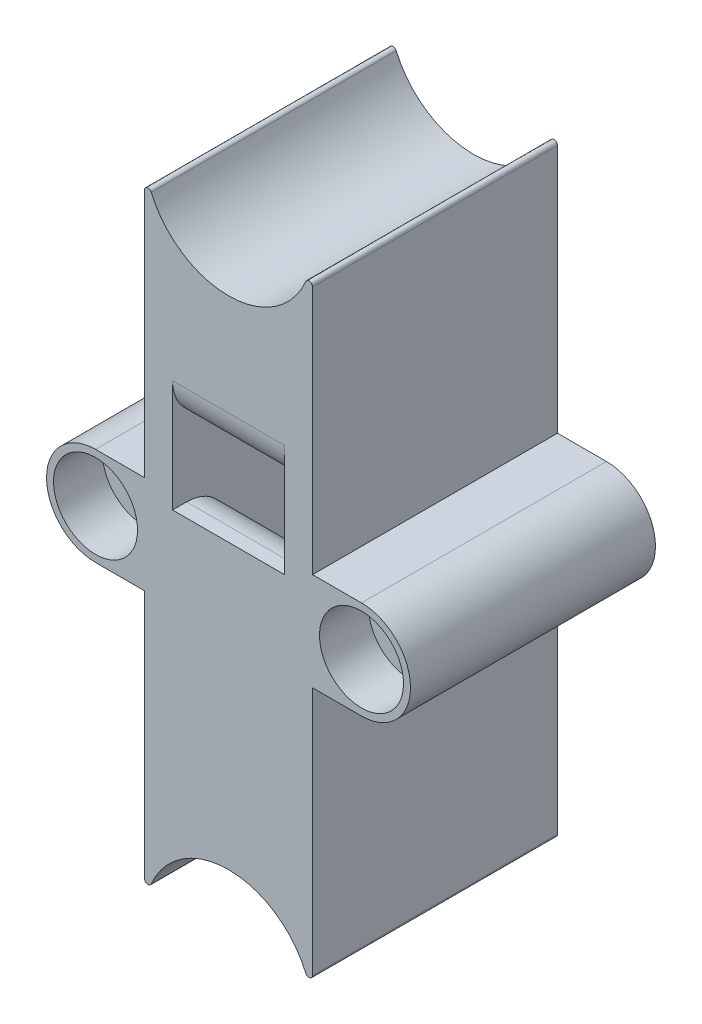
ISO-10303-21;
HEADER;
FILE_DESCRIPTION(('STEP AP214'),'2;1');
FILE_NAME('part.step','',(''),(''),'','','');
FILE_SCHEMA(('AUTOMOTIVE_DESIGN { 1 0 10303 214 1 1 1 1 }'));
ENDSEC;
DATA;
#1=APPLICATION_CONTEXT('core data for automotive mechanical design processes');
#2=APPLICATION_PROTOCOL_DEFINITION('international standard','automotive_design',2000,#1);
#3=PRODUCT_CONTEXT('',#1,'mechanical');
#4=PRODUCT('Part','Part','',(#3));
#5=PRODUCT_RELATED_PRODUCT_CATEGORY('part','',(#4));
#6=PRODUCT_DEFINITION_FORMATION('','',#4);
#7=PRODUCT_DEFINITION_CONTEXT('part definition',#1,'design');
#8=PRODUCT_DEFINITION('design','',#6,#7);
#9=PRODUCT_DEFINITION_SHAPE('','',#8);
#10=(LENGTH_UNIT() NAMED_UNIT(*) SI_UNIT(.MILLI.,.METRE.));
#11=(NAMED_UNIT(*) PLANE_ANGLE_UNIT() SI_UNIT($,.RADIAN.));
#12=(NAMED_UNIT(*) SI_UNIT($,.STERADIAN.) SOLID_ANGLE_UNIT());
#13=UNCERTAINTY_MEASURE_WITH_UNIT(LENGTH_MEASURE(1.E-05),#10,'distance_accuracy_value','');
#14=(GEOMETRIC_REPRESENTATION_CONTEXT(3) GLOBAL_UNCERTAINTY_ASSIGNED_CONTEXT((#13)) GLOBAL_UNIT_ASSIGNED_CONTEXT((#10,
#11,#12)) REPRESENTATION_CONTEXT('',''));
#15=CARTESIAN_POINT('',(0.,0.,0.));
#16=DIRECTION('',(0.,0.,1.));
#17=DIRECTION('',(1.,0.,0.));
#18=AXIS2_PLACEMENT_3D('',#15,#16,#17);
#19=CARTESIAN_POINT('',(-9.5,0.,17.5));
#20=DIRECTION('',(0.,0.,-1.));
#21=DIRECTION('',(-1.,0.,0.));
#22=AXIS2_PLACEMENT_3D('',#19,#20,#21);
#23=CYLINDRICAL_SURFACE('',#22,1.65);
#24=CARTESIAN_POINT('',(-9.5,0.,0.));
#25=DIRECTION('',(0.,0.,1.));
#26=DIRECTION('',(1.,0.,0.));
#27=AXIS2_PLACEMENT_3D('',#24,#25,#26);
#28=CIRCLE('',#27,1.65);
#29=CARTESIAN_POINT('',(-7.85,0.,0.));
#30=VERTEX_POINT('',#29);
#31=EDGE_CURVE('E317',#30,#30,#28,.T.);
#32=ORIENTED_EDGE('',*,*,#31,.F.);
#33=EDGE_LOOP('',(#32));
#34=FACE_BOUND('',#33,.T.);
#35=CARTESIAN_POINT('',(-9.5,0.,14.));
#36=DIRECTION('',(0.,0.,1.));
#37=DIRECTION('',(1.,0.,0.));
#38=AXIS2_PLACEMENT_3D('',#35,#36,#37);
#39=CIRCLE('',#38,1.65);
#40=CARTESIAN_POINT('',(-7.85,0.,14.));
#41=VERTEX_POINT('',#40);
#42=EDGE_CURVE('E45',#41,#41,#39,.T.);
#43=ORIENTED_EDGE('',*,*,#42,.T.);
#44=EDGE_LOOP('',(#43));
#45=FACE_BOUND('',#44,.T.);
#46=ADVANCED_FACE('F41',(#34,#45),#23,.F.);
#47=CARTESIAN_POINT('',(9.5,0.,17.5));
#48=DIRECTION('',(0.,0.,-1.));
#49=DIRECTION('',(-1.,0.,0.));
#50=AXIS2_PLACEMENT_3D('',#47,#48,#49);
#51=CYLINDRICAL_SURFACE('',#50,1.65);
#52=CARTESIAN_POINT('',(9.5,0.,0.));
#53=DIRECTION('',(0.,0.,1.));
#54=DIRECTION('',(1.,0.,0.));
#55=AXIS2_PLACEMENT_3D('',#52,#53,#54);
#56=CIRCLE('',#55,1.65);
#57=CARTESIAN_POINT('',(11.15,0.,0.));
#58=VERTEX_POINT('',#57);
#59=EDGE_CURVE('E265',#58,#58,#56,.T.);
#60=ORIENTED_EDGE('',*,*,#59,.F.);
#61=EDGE_LOOP('',(#60));
#62=FACE_BOUND('',#61,.T.);
#63=CARTESIAN_POINT('',(9.5,0.,14.));
#64=DIRECTION('',(0.,0.,1.));
#65=DIRECTION('',(1.,0.,0.));
#66=AXIS2_PLACEMENT_3D('',#63,#64,#65);
#67=CIRCLE('',#66,1.65);
#68=CARTESIAN_POINT('',(11.15,0.,14.));
#69=VERTEX_POINT('',#68);
#70=EDGE_CURVE('E228',#69,#69,#67,.T.);
#71=ORIENTED_EDGE('',*,*,#70,.T.);
#72=EDGE_LOOP('',(#71));
#73=FACE_BOUND('',#72,.T.);
#74=ADVANCED_FACE('F426',(#62,#73),#51,.F.);
#75=CARTESIAN_POINT('',(0.,3.5,17.5));
#76=DIRECTION('',(0.,-1.,0.));
#77=DIRECTION('',(1.,0.,0.));
#78=AXIS2_PLACEMENT_3D('',#75,#76,#77);
#79=PLANE('',#78);
#80=DIRECTION('',(-1.,0.,0.));
#81=VECTOR('',#80,1.);
#82=CARTESIAN_POINT('',(0.,3.5,0.));
#83=LINE('',#82,#81);
#84=CARTESIAN_POINT('',(-6.,3.5,0.));
#85=VERTEX_POINT('',#84);
#86=CARTESIAN_POINT('',(-9.5,3.5,0.));
#87=VERTEX_POINT('',#86);
#88=EDGE_CURVE('E253',#85,#87,#83,.T.);
#89=ORIENTED_EDGE('',*,*,#88,.T.);
#90=DIRECTION('',(0.,0.,-1.));
#91=VECTOR('',#90,1.);
#92=CARTESIAN_POINT('',(-9.5,3.5,17.5));
#93=LINE('',#92,#91);
#94=CARTESIAN_POINT('',(-9.5,3.5,17.5));
#95=VERTEX_POINT('',#94);
#96=EDGE_CURVE('E339',#95,#87,#93,.T.);
#97=ORIENTED_EDGE('',*,*,#96,.F.);
#98=DIRECTION('',(-1.,0.,0.));
#99=VECTOR('',#98,1.);
#100=CARTESIAN_POINT('',(0.,3.5,17.5));
#101=LINE('',#100,#99);
#102=CARTESIAN_POINT('',(-6.,3.5,17.5));
#103=VERTEX_POINT('',#102);
#104=EDGE_CURVE('E261',#103,#95,#101,.T.);
#105=ORIENTED_EDGE('',*,*,#104,.F.);
#106=DIRECTION('',(0.,0.,-1.));
#107=VECTOR('',#106,1.);
#108=CARTESIAN_POINT('',(-6.,3.5,17.5));
#109=LINE('',#108,#107);
#110=EDGE_CURVE('E322',#103,#85,#109,.T.);
#111=ORIENTED_EDGE('',*,*,#110,.T.);
#112=EDGE_LOOP('',(#89,#97,#105,#111));
#113=FACE_BOUND('',#112,.T.);
#114=ADVANCED_FACE('F432',(#113),#79,.F.);
#115=CARTESIAN_POINT('',(-9.5,0.,17.5));
#116=DIRECTION('',(0.,0.,-1.));
#117=DIRECTION('',(-1.,0.,0.));
#118=AXIS2_PLACEMENT_3D('',#115,#116,#117);
#119=CYLINDRICAL_SURFACE('',#118,3.5);
#120=CARTESIAN_POINT('',(-9.5,0.,0.));
#121=DIRECTION('',(0.,0.,1.));
#122=DIRECTION('',(1.,0.,0.));
#123=AXIS2_PLACEMENT_3D('',#120,#121,#122);
#124=CIRCLE('',#123,3.5);
#125=CARTESIAN_POINT('',(-9.5,-3.5,0.));
#126=VERTEX_POINT('',#125);
#127=EDGE_CURVE('E291',#87,#126,#124,.T.);
#128=ORIENTED_EDGE('',*,*,#127,.T.);
#129=DIRECTION('',(0.,0.,-1.));
#130=VECTOR('',#129,1.);
#131=CARTESIAN_POINT('',(-9.5,-3.5,17.5));
#132=LINE('',#131,#130);
#133=CARTESIAN_POINT('',(-9.5,-3.5,17.5));
#134=VERTEX_POINT('',#133);
#135=EDGE_CURVE('E337',#134,#126,#132,.T.);
#136=ORIENTED_EDGE('',*,*,#135,.F.);
#137=CARTESIAN_POINT('',(-9.5,0.,17.5));
#138=DIRECTION('',(0.,0.,1.));
#139=DIRECTION('',(1.,0.,0.));
#140=AXIS2_PLACEMENT_3D('',#137,#138,#139);
#141=CIRCLE('',#140,3.5);
#142=EDGE_CURVE('E264',#95,#134,#141,.T.);
#143=ORIENTED_EDGE('',*,*,#142,.F.);
#144=ORIENTED_EDGE('',*,*,#96,.T.);
#145=EDGE_LOOP('',(#128,#136,#143,#144));
#146=FACE_BOUND('',#145,.T.);
#147=ADVANCED_FACE('F473',(#146),#119,.T.);
#148=CARTESIAN_POINT('',(0.,-3.5,17.5));
#149=DIRECTION('',(0.,-1.,0.));
#150=DIRECTION('',(1.,0.,0.));
#151=AXIS2_PLACEMENT_3D('',#148,#149,#150);
#152=PLANE('',#151);
#153=DIRECTION('',(-1.,0.,0.));
#154=VECTOR('',#153,1.);
#155=CARTESIAN_POINT('',(0.,-3.5,0.));
#156=LINE('',#155,#154);
#157=CARTESIAN_POINT('',(-6.,-3.5,0.));
#158=VERTEX_POINT('',#157);
#159=EDGE_CURVE('E294',#158,#126,#156,.T.);
#160=ORIENTED_EDGE('',*,*,#159,.F.);
#161=DIRECTION('',(0.,0.,-1.));
#162=VECTOR('',#161,1.);
#163=CARTESIAN_POINT('',(-6.,-3.5,17.5));
#164=LINE('',#163,#162);
#165=CARTESIAN_POINT('',(-6.,-3.5,17.5));
#166=VERTEX_POINT('',#165);
#167=EDGE_CURVE('E334',#166,#158,#164,.T.);
#168=ORIENTED_EDGE('',*,*,#167,.F.);
#169=DIRECTION('',(-1.,0.,0.));
#170=VECTOR('',#169,1.);
#171=CARTESIAN_POINT('',(0.,-3.5,17.5));
#172=LINE('',#171,#170);
#173=EDGE_CURVE('E267',#166,#134,#172,.T.);
#174=ORIENTED_EDGE('',*,*,#173,.T.);
#175=ORIENTED_EDGE('',*,*,#135,.T.);
#176=EDGE_LOOP('',(#160,#168,#174,#175));
#177=FACE_BOUND('',#176,.T.);
#178=ADVANCED_FACE('F470',(#177),#152,.T.);
#179=CARTESIAN_POINT('',(-6.,0.,17.5));
#180=DIRECTION('',(-1.,0.,0.));
#181=DIRECTION('',(0.,0.,1.));
#182=AXIS2_PLACEMENT_3D('',#179,#180,#181);
#183=PLANE('',#182);
#184=DIRECTION('',(0.,1.,0.));
#185=VECTOR('',#184,1.);
#186=CARTESIAN_POINT('',(-6.,0.,0.));
#187=LINE('',#186,#185);
#188=CARTESIAN_POINT('',(-6.,-21.3005102572168,0.));
#189=VERTEX_POINT('',#188);
#190=EDGE_CURVE('E297',#189,#158,#187,.T.);
#191=ORIENTED_EDGE('',*,*,#190,.F.);
#192=DIRECTION('',(0.,0.,-1.));
#193=VECTOR('',#192,1.);
#194=CARTESIAN_POINT('',(-6.,-21.3005102572168,17.5));
#195=LINE('',#194,#193);
#196=CARTESIAN_POINT('',(-6.,-21.3005102572168,17.5));
#197=VERTEX_POINT('',#196);
#198=EDGE_CURVE('E355',#189,#197,#195,.F.);
#199=ORIENTED_EDGE('',*,*,#198,.T.);
#200=DIRECTION('',(0.,1.,0.));
#201=VECTOR('',#200,1.);
#202=CARTESIAN_POINT('',(-6.,0.,17.5));
#203=LINE('',#202,#201);
#204=EDGE_CURVE('E270',#197,#166,#203,.T.);
#205=ORIENTED_EDGE('',*,*,#204,.T.);
#206=ORIENTED_EDGE('',*,*,#167,.T.);
#207=EDGE_LOOP('',(#191,#199,#205,#206));
#208=FACE_BOUND('',#207,.T.);
#209=ADVANCED_FACE('F445',(#208),#183,.T.);
#210=CARTESIAN_POINT('',(0.,-23.75,17.5));
#211=DIRECTION('',(0.,0.,-1.));
#212=DIRECTION('',(-1.,0.,0.));
#213=AXIS2_PLACEMENT_3D('',#210,#211,#212);
#214=CYLINDRICAL_SURFACE('',#213,6.);
#215=CARTESIAN_POINT('',(0.,-23.75,17.5));
#216=DIRECTION('',(0.,0.,1.));
#217=DIRECTION('',(1.,0.,0.));
#218=AXIS2_PLACEMENT_3D('',#215,#216,#217);
#219=CIRCLE('',#218,6.);
#220=CARTESIAN_POINT('',(5.52,-21.3984898469282,17.5));
#221=VERTEX_POINT('',#220);
#222=CARTESIAN_POINT('',(-5.52,-21.3984898469282,17.5));
#223=VERTEX_POINT('',#222);
#224=EDGE_CURVE('E272',#221,#223,#219,.T.);
#225=ORIENTED_EDGE('',*,*,#224,.T.);
#226=DIRECTION('',(0.,0.,-1.));
#227=VECTOR('',#226,1.);
#228=CARTESIAN_POINT('',(-5.52,-21.3984898469282,17.5));
#229=LINE('',#228,#227);
#230=CARTESIAN_POINT('',(-5.52,-21.3984898469282,0.));
#231=VERTEX_POINT('',#230);
#232=EDGE_CURVE('E344',#223,#231,#229,.T.);
#233=ORIENTED_EDGE('',*,*,#232,.T.);
#234=CARTESIAN_POINT('',(0.,-23.75,0.));
#235=DIRECTION('',(0.,0.,1.));
#236=DIRECTION('',(1.,0.,0.));
#237=AXIS2_PLACEMENT_3D('',#234,#235,#236);
#238=CIRCLE('',#237,6.);
#239=CARTESIAN_POINT('',(5.52,-21.3984898469282,0.));
#240=VERTEX_POINT('',#239);
#241=EDGE_CURVE('E299',#240,#231,#238,.T.);
#242=ORIENTED_EDGE('',*,*,#241,.F.);
#243=DIRECTION('',(0.,0.,-1.));
#244=VECTOR('',#243,1.);
#245=CARTESIAN_POINT('',(5.52,-21.3984898469282,17.5));
#246=LINE('',#245,#244);
#247=EDGE_CURVE('E342',#240,#221,#246,.F.);
#248=ORIENTED_EDGE('',*,*,#247,.T.);
#249=EDGE_LOOP('',(#225,#233,#242,#248));
#250=FACE_BOUND('',#249,.T.);
#251=ADVANCED_FACE('F466',(#250),#214,.F.);
#252=CARTESIAN_POINT('',(6.,0.,17.5));
#253=DIRECTION('',(-1.,0.,0.));
#254=DIRECTION('',(0.,0.,1.));
#255=AXIS2_PLACEMENT_3D('',#252,#253,#254);
#256=PLANE('',#255);
#257=DIRECTION('',(0.,1.,0.));
#258=VECTOR('',#257,1.);
#259=CARTESIAN_POINT('',(6.,0.,17.5));
#260=LINE('',#259,#258);
#261=CARTESIAN_POINT('',(6.,-21.3005102572168,17.5));
#262=VERTEX_POINT('',#261);
#263=CARTESIAN_POINT('',(6.,-3.5,17.5));
#264=VERTEX_POINT('',#263);
#265=EDGE_CURVE('E276',#262,#264,#260,.T.);
#266=ORIENTED_EDGE('',*,*,#265,.F.);
#267=DIRECTION('',(0.,0.,1.));
#268=VECTOR('',#267,1.);
#269=CARTESIAN_POINT('',(6.,-21.3005102572168,0.));
#270=LINE('',#269,#268);
#271=CARTESIAN_POINT('',(6.,-21.3005102572168,0.));
#272=VERTEX_POINT('',#271);
#273=EDGE_CURVE('E365',#262,#272,#270,.F.);
#274=ORIENTED_EDGE('',*,*,#273,.T.);
#275=DIRECTION('',(0.,1.,0.));
#276=VECTOR('',#275,1.);
#277=CARTESIAN_POINT('',(6.,0.,0.));
#278=LINE('',#277,#276);
#279=CARTESIAN_POINT('',(6.,-3.5,0.));
#280=VERTEX_POINT('',#279);
#281=EDGE_CURVE('E303',#272,#280,#278,.T.);
#282=ORIENTED_EDGE('',*,*,#281,.T.);
#283=DIRECTION('',(0.,0.,-1.));
#284=VECTOR('',#283,1.);
#285=CARTESIAN_POINT('',(6.,-3.5,17.5));
#286=LINE('',#285,#284);
#287=EDGE_CURVE('E331',#264,#280,#286,.T.);
#288=ORIENTED_EDGE('',*,*,#287,.F.);
#289=EDGE_LOOP('',(#266,#274,#282,#288));
#290=FACE_BOUND('',#289,.T.);
#291=ADVANCED_FACE('F454',(#290),#256,.F.);
#292=CARTESIAN_POINT('',(0.,-3.5,17.5));
#293=DIRECTION('',(0.,1.,0.));
#294=DIRECTION('',(-1.,0.,0.));
#295=AXIS2_PLACEMENT_3D('',#292,#293,#294);
#296=PLANE('',#295);
#297=DIRECTION('',(1.,0.,0.));
#298=VECTOR('',#297,1.);
#299=CARTESIAN_POINT('',(0.,-3.5,0.));
#300=LINE('',#299,#298);
#301=CARTESIAN_POINT('',(9.5,-3.5,0.));
#302=VERTEX_POINT('',#301);
#303=EDGE_CURVE('E305',#280,#302,#300,.T.);
#304=ORIENTED_EDGE('',*,*,#303,.T.);
#305=DIRECTION('',(0.,0.,-1.));
#306=VECTOR('',#305,1.);
#307=CARTESIAN_POINT('',(9.5,-3.5,17.5));
#308=LINE('',#307,#306);
#309=CARTESIAN_POINT('',(9.5,-3.5,17.5));
#310=VERTEX_POINT('',#309);
#311=EDGE_CURVE('E328',#310,#302,#308,.T.);
#312=ORIENTED_EDGE('',*,*,#311,.F.);
#313=DIRECTION('',(1.,0.,0.));
#314=VECTOR('',#313,1.);
#315=CARTESIAN_POINT('',(0.,-3.5,17.5));
#316=LINE('',#315,#314);
#317=EDGE_CURVE('E278',#264,#310,#316,.T.);
#318=ORIENTED_EDGE('',*,*,#317,.F.);
#319=ORIENTED_EDGE('',*,*,#287,.T.);
#320=EDGE_LOOP('',(#304,#312,#318,#319));
#321=FACE_BOUND('',#320,.T.);
#322=ADVANCED_FACE('F461',(#321),#296,.F.);
#323=CARTESIAN_POINT('',(9.5,0.,17.5));
#324=DIRECTION('',(0.,0.,-1.));
#325=DIRECTION('',(-1.,0.,0.));
#326=AXIS2_PLACEMENT_3D('',#323,#324,#325);
#327=CYLINDRICAL_SURFACE('',#326,3.5);
#328=CARTESIAN_POINT('',(9.5,0.,0.));
#329=DIRECTION('',(0.,0.,1.));
#330=DIRECTION('',(1.,0.,0.));
#331=AXIS2_PLACEMENT_3D('',#328,#329,#330);
#332=CIRCLE('',#331,3.5);
#333=CARTESIAN_POINT('',(9.5,3.5,0.));
#334=VERTEX_POINT('',#333);
#335=EDGE_CURVE('E308',#302,#334,#332,.T.);
#336=ORIENTED_EDGE('',*,*,#335,.T.);
#337=DIRECTION('',(0.,0.,-1.));
#338=VECTOR('',#337,1.);
#339=CARTESIAN_POINT('',(9.5,3.5,17.5));
#340=LINE('',#339,#338);
#341=CARTESIAN_POINT('',(9.5,3.5,17.5));
#342=VERTEX_POINT('',#341);
#343=EDGE_CURVE('E326',#342,#334,#340,.T.);
#344=ORIENTED_EDGE('',*,*,#343,.F.);
#345=CARTESIAN_POINT('',(9.5,0.,17.5));
#346=DIRECTION('',(0.,0.,1.));
#347=DIRECTION('',(1.,0.,0.));
#348=AXIS2_PLACEMENT_3D('',#345,#346,#347);
#349=CIRCLE('',#348,3.5);
#350=EDGE_CURVE('E281',#310,#342,#349,.T.);
#351=ORIENTED_EDGE('',*,*,#350,.F.);
#352=ORIENTED_EDGE('',*,*,#311,.T.);
#353=EDGE_LOOP('',(#336,#344,#351,#352));
#354=FACE_BOUND('',#353,.T.);
#355=ADVANCED_FACE('F457',(#354),#327,.T.);
#356=CARTESIAN_POINT('',(0.,3.5,17.5));
#357=DIRECTION('',(0.,1.,0.));
#358=DIRECTION('',(-1.,0.,0.));
#359=AXIS2_PLACEMENT_3D('',#356,#357,#358);
#360=PLANE('',#359);
#361=DIRECTION('',(1.,0.,0.));
#362=VECTOR('',#361,1.);
#363=CARTESIAN_POINT('',(0.,3.5,0.));
#364=LINE('',#363,#362);
#365=CARTESIAN_POINT('',(6.,3.5,0.));
#366=VERTEX_POINT('',#365);
#367=EDGE_CURVE('E311',#366,#334,#364,.T.);
#368=ORIENTED_EDGE('',*,*,#367,.F.);
#369=DIRECTION('',(0.,0.,-1.));
#370=VECTOR('',#369,1.);
#371=CARTESIAN_POINT('',(6.,3.5,17.5));
#372=LINE('',#371,#370);
#373=CARTESIAN_POINT('',(6.,3.5,17.5));
#374=VERTEX_POINT('',#373);
#375=EDGE_CURVE('E324',#374,#366,#372,.T.);
#376=ORIENTED_EDGE('',*,*,#375,.F.);
#377=DIRECTION('',(1.,0.,0.));
#378=VECTOR('',#377,1.);
#379=CARTESIAN_POINT('',(0.,3.5,17.5));
#380=LINE('',#379,#378);
#381=EDGE_CURVE('E283',#374,#342,#380,.T.);
#382=ORIENTED_EDGE('',*,*,#381,.T.);
#383=ORIENTED_EDGE('',*,*,#343,.T.);
#384=EDGE_LOOP('',(#368,#376,#382,#383));
#385=FACE_BOUND('',#384,.T.);
#386=ADVANCED_FACE('F452',(#385),#360,.T.);
#387=CARTESIAN_POINT('',(6.,21.3005102572168,0.));
#388=VERTEX_POINT('',#387);
#389=EDGE_CURVE('E306',#366,#388,#278,.T.);
#390=ORIENTED_EDGE('',*,*,#389,.T.);
#391=DIRECTION('',(0.,0.,1.));
#392=VECTOR('',#391,1.);
#393=CARTESIAN_POINT('',(6.,21.3005102572168,17.5));
#394=LINE('',#393,#392);
#395=CARTESIAN_POINT('',(6.,21.3005102572168,17.5));
#396=VERTEX_POINT('',#395);
#397=EDGE_CURVE('E373',#388,#396,#394,.T.);
#398=ORIENTED_EDGE('',*,*,#397,.T.);
#399=EDGE_CURVE('E279',#374,#396,#260,.T.);
#400=ORIENTED_EDGE('',*,*,#399,.F.);
#401=ORIENTED_EDGE('',*,*,#375,.T.);
#402=EDGE_LOOP('',(#390,#398,#400,#401));
#403=FACE_BOUND('',#402,.T.);
#404=ADVANCED_FACE('F448',(#403),#256,.F.);
#405=CARTESIAN_POINT('',(0.,23.75,17.5));
#406=DIRECTION('',(0.,0.,-1.));
#407=DIRECTION('',(-1.,0.,0.));
#408=AXIS2_PLACEMENT_3D('',#405,#406,#407);
#409=CYLINDRICAL_SURFACE('',#408,6.);
#410=CARTESIAN_POINT('',(0.,23.75,17.5));
#411=DIRECTION('',(0.,0.,1.));
#412=DIRECTION('',(1.,0.,0.));
#413=AXIS2_PLACEMENT_3D('',#410,#411,#412);
#414=CIRCLE('',#413,6.);
#415=CARTESIAN_POINT('',(-5.52,21.3984898469281,17.5));
#416=VERTEX_POINT('',#415);
#417=CARTESIAN_POINT('',(5.52,21.3984898469281,17.5));
#418=VERTEX_POINT('',#417);
#419=EDGE_CURVE('E286',#416,#418,#414,.T.);
#420=ORIENTED_EDGE('',*,*,#419,.T.);
#421=DIRECTION('',(0.,0.,-1.));
#422=VECTOR('',#421,1.);
#423=CARTESIAN_POINT('',(5.52,21.3984898469281,17.5));
#424=LINE('',#423,#422);
#425=CARTESIAN_POINT('',(5.52,21.3984898469281,0.));
#426=VERTEX_POINT('',#425);
#427=EDGE_CURVE('E370',#418,#426,#424,.T.);
#428=ORIENTED_EDGE('',*,*,#427,.T.);
#429=CARTESIAN_POINT('',(0.,23.75,0.));
#430=DIRECTION('',(0.,0.,1.));
#431=DIRECTION('',(1.,0.,0.));
#432=AXIS2_PLACEMENT_3D('',#429,#430,#431);
#433=CIRCLE('',#432,6.);
#434=CARTESIAN_POINT('',(-5.52,21.3984898469281,0.));
#435=VERTEX_POINT('',#434);
#436=EDGE_CURVE('E314',#435,#426,#433,.T.);
#437=ORIENTED_EDGE('',*,*,#436,.F.);
#438=DIRECTION('',(0.,0.,-1.));
#439=VECTOR('',#438,1.);
#440=CARTESIAN_POINT('',(-5.52,21.3984898469281,17.5));
#441=LINE('',#440,#439);
#442=EDGE_CURVE('E368',#435,#416,#441,.F.);
#443=ORIENTED_EDGE('',*,*,#442,.T.);
#444=EDGE_LOOP('',(#420,#428,#437,#443));
#445=FACE_BOUND('',#444,.T.);
#446=ADVANCED_FACE('F443',(#445),#409,.F.);
#447=CARTESIAN_POINT('',(-6.,21.3005102572168,17.5));
#448=VERTEX_POINT('',#447);
#449=EDGE_CURVE('E273',#103,#448,#203,.T.);
#450=ORIENTED_EDGE('',*,*,#449,.T.);
#451=DIRECTION('',(0.,0.,-1.));
#452=VECTOR('',#451,1.);
#453=CARTESIAN_POINT('',(-6.,21.3005102572168,17.5));
#454=LINE('',#453,#452);
#455=CARTESIAN_POINT('',(-6.,21.3005102572168,0.));
#456=VERTEX_POINT('',#455);
#457=EDGE_CURVE('E375',#448,#456,#454,.T.);
#458=ORIENTED_EDGE('',*,*,#457,.T.);
#459=EDGE_CURVE('E300',#85,#456,#187,.T.);
#460=ORIENTED_EDGE('',*,*,#459,.F.);
#461=ORIENTED_EDGE('',*,*,#110,.F.);
#462=EDGE_LOOP('',(#450,#458,#460,#461));
#463=FACE_BOUND('',#462,.T.);
#464=ADVANCED_FACE('F439',(#463),#183,.T.);
#465=CARTESIAN_POINT('',(0.,0.,17.5));
#466=DIRECTION('',(0.,0.,1.));
#467=DIRECTION('',(1.,0.,0.));
#468=AXIS2_PLACEMENT_3D('',#465,#466,#467);
#469=PLANE('',#468);
#470=CARTESIAN_POINT('',(-9.5,0.,17.5));
#471=DIRECTION('',(0.,0.,1.));
#472=DIRECTION('',(1.,0.,0.));
#473=AXIS2_PLACEMENT_3D('',#470,#471,#472);
#474=CIRCLE('',#473,3.);
#475=CARTESIAN_POINT('',(-6.5,0.,17.5));
#476=VERTEX_POINT('',#475);
#477=EDGE_CURVE('E396',#476,#476,#474,.T.);
#478=ORIENTED_EDGE('',*,*,#477,.F.);
#479=EDGE_LOOP('',(#478));
#480=FACE_BOUND('',#479,.T.);
#481=CARTESIAN_POINT('',(9.5,0.,17.5));
#482=DIRECTION('',(0.,0.,1.));
#483=DIRECTION('',(1.,0.,0.));
#484=AXIS2_PLACEMENT_3D('',#481,#482,#483);
#485=CIRCLE('',#484,3.);
#486=CARTESIAN_POINT('',(12.5,0.,17.5));
#487=VERTEX_POINT('',#486);
#488=EDGE_CURVE('E401',#487,#487,#485,.T.);
#489=ORIENTED_EDGE('',*,*,#488,.F.);
#490=EDGE_LOOP('',(#489));
#491=FACE_BOUND('',#490,.T.);
#492=DIRECTION('',(1.,0.,0.));
#493=VECTOR('',#492,1.);
#494=CARTESIAN_POINT('',(0.,10.5,17.5));
#495=LINE('',#494,#493);
#496=CARTESIAN_POINT('',(-4.,10.5,17.5));
#497=VERTEX_POINT('',#496);
#498=CARTESIAN_POINT('',(4.,10.5,17.5));
#499=VERTEX_POINT('',#498);
#500=EDGE_CURVE('E378',#497,#499,#495,.T.);
#501=ORIENTED_EDGE('',*,*,#500,.T.);
#502=DIRECTION('',(0.,1.,0.));
#503=VECTOR('',#502,1.);
#504=CARTESIAN_POINT('',(4.,0.,17.5));
#505=LINE('',#504,#503);
#506=CARTESIAN_POINT('',(4.,2.5,17.5));
#507=VERTEX_POINT('',#506);
#508=EDGE_CURVE('E248',#507,#499,#505,.T.);
#509=ORIENTED_EDGE('',*,*,#508,.F.);
#510=DIRECTION('',(1.,0.,0.));
#511=VECTOR('',#510,1.);
#512=CARTESIAN_POINT('',(0.,2.5,17.5));
#513=LINE('',#512,#511);
#514=CARTESIAN_POINT('',(-4.,2.5,17.5));
#515=VERTEX_POINT('',#514);
#516=EDGE_CURVE('E235',#515,#507,#513,.T.);
#517=ORIENTED_EDGE('',*,*,#516,.F.);
#518=DIRECTION('',(0.,1.,0.));
#519=VECTOR('',#518,1.);
#520=CARTESIAN_POINT('',(-4.,0.,17.5));
#521=LINE('',#520,#519);
#522=EDGE_CURVE('E241',#515,#497,#521,.T.);
#523=ORIENTED_EDGE('',*,*,#522,.T.);
#524=EDGE_LOOP('',(#501,#509,#517,#523));
#525=FACE_BOUND('',#524,.T.);
#526=ORIENTED_EDGE('',*,*,#204,.F.);
#527=CARTESIAN_POINT('',(-5.75,-21.3005102572168,17.5));
#528=DIRECTION('',(0.,0.,1.));
#529=DIRECTION('',(1.,0.,0.));
#530=AXIS2_PLACEMENT_3D('',#527,#528,#529);
#531=CIRCLE('',#530,0.25);
#532=EDGE_CURVE('E363',#197,#223,#531,.T.);
#533=ORIENTED_EDGE('',*,*,#532,.T.);
#534=ORIENTED_EDGE('',*,*,#224,.F.);
#535=CARTESIAN_POINT('',(5.75,-21.3005102572168,17.5));
#536=DIRECTION('',(0.,0.,1.));
#537=DIRECTION('',(1.,0.,0.));
#538=AXIS2_PLACEMENT_3D('',#535,#536,#537);
#539=CIRCLE('',#538,0.25);
#540=EDGE_CURVE('E361',#221,#262,#539,.T.);
#541=ORIENTED_EDGE('',*,*,#540,.T.);
#542=ORIENTED_EDGE('',*,*,#265,.T.);
#543=ORIENTED_EDGE('',*,*,#317,.T.);
#544=ORIENTED_EDGE('',*,*,#350,.T.);
#545=ORIENTED_EDGE('',*,*,#381,.F.);
#546=ORIENTED_EDGE('',*,*,#399,.T.);
#547=CARTESIAN_POINT('',(5.75,21.3005102572168,17.5));
#548=DIRECTION('',(0.,0.,1.));
#549=DIRECTION('',(1.,0.,0.));
#550=AXIS2_PLACEMENT_3D('',#547,#548,#549);
#551=CIRCLE('',#550,0.25);
#552=EDGE_CURVE('E359',#396,#418,#551,.T.);
#553=ORIENTED_EDGE('',*,*,#552,.T.);
#554=ORIENTED_EDGE('',*,*,#419,.F.);
#555=CARTESIAN_POINT('',(-5.75,21.3005102572168,17.5));
#556=DIRECTION('',(0.,0.,1.));
#557=DIRECTION('',(1.,0.,0.));
#558=AXIS2_PLACEMENT_3D('',#555,#556,#557);
#559=CIRCLE('',#558,0.25);
#560=EDGE_CURVE('E357',#416,#448,#559,.T.);
#561=ORIENTED_EDGE('',*,*,#560,.T.);
#562=ORIENTED_EDGE('',*,*,#449,.F.);
#563=ORIENTED_EDGE('',*,*,#104,.T.);
#564=ORIENTED_EDGE('',*,*,#142,.T.);
#565=ORIENTED_EDGE('',*,*,#173,.F.);
#566=EDGE_LOOP('',(#526,#533,#534,#541,#542,#543,#544,#545,#546,#553,#554,#561,#562,#563,#564,#565));
#567=FACE_BOUND('',#566,.T.);
#568=ADVANCED_FACE('F442',(#480,#491,#525,#567),#469,.T.);
#569=CARTESIAN_POINT('',(0.,0.,0.));
#570=DIRECTION('',(0.,0.,1.));
#571=DIRECTION('',(1.,0.,0.));
#572=AXIS2_PLACEMENT_3D('',#569,#570,#571);
#573=PLANE('',#572);
#574=ORIENTED_EDGE('',*,*,#241,.T.);
#575=CARTESIAN_POINT('',(-5.75,-21.3005102572168,0.));
#576=DIRECTION('',(0.,0.,1.));
#577=DIRECTION('',(1.,0.,0.));
#578=AXIS2_PLACEMENT_3D('',#575,#576,#577);
#579=CIRCLE('',#578,0.25);
#580=EDGE_CURVE('E353',#231,#189,#579,.F.);
#581=ORIENTED_EDGE('',*,*,#580,.T.);
#582=ORIENTED_EDGE('',*,*,#190,.T.);
#583=ORIENTED_EDGE('',*,*,#159,.T.);
#584=ORIENTED_EDGE('',*,*,#127,.F.);
#585=ORIENTED_EDGE('',*,*,#88,.F.);
#586=ORIENTED_EDGE('',*,*,#459,.T.);
#587=CARTESIAN_POINT('',(-5.75,21.3005102572168,0.));
#588=DIRECTION('',(0.,0.,1.));
#589=DIRECTION('',(1.,0.,0.));
#590=AXIS2_PLACEMENT_3D('',#587,#588,#589);
#591=CIRCLE('',#590,0.25);
#592=EDGE_CURVE('E347',#456,#435,#591,.F.);
#593=ORIENTED_EDGE('',*,*,#592,.T.);
#594=ORIENTED_EDGE('',*,*,#436,.T.);
#595=CARTESIAN_POINT('',(5.75,21.3005102572168,0.));
#596=DIRECTION('',(0.,0.,1.));
#597=DIRECTION('',(1.,0.,0.));
#598=AXIS2_PLACEMENT_3D('',#595,#596,#597);
#599=CIRCLE('',#598,0.25);
#600=EDGE_CURVE('E349',#426,#388,#599,.F.);
#601=ORIENTED_EDGE('',*,*,#600,.T.);
#602=ORIENTED_EDGE('',*,*,#389,.F.);
#603=ORIENTED_EDGE('',*,*,#367,.T.);
#604=ORIENTED_EDGE('',*,*,#335,.F.);
#605=ORIENTED_EDGE('',*,*,#303,.F.);
#606=ORIENTED_EDGE('',*,*,#281,.F.);
#607=CARTESIAN_POINT('',(5.75,-21.3005102572168,0.));
#608=DIRECTION('',(0.,0.,1.));
#609=DIRECTION('',(1.,0.,0.));
#610=AXIS2_PLACEMENT_3D('',#607,#608,#609);
#611=CIRCLE('',#610,0.25);
#612=EDGE_CURVE('E351',#272,#240,#611,.F.);
#613=ORIENTED_EDGE('',*,*,#612,.T.);
#614=EDGE_LOOP('',(#574,#581,#582,#583,#584,#585,#586,#593,#594,#601,#602,#603,#604,#605,#606,#613));
#615=FACE_BOUND('',#614,.T.);
#616=ORIENTED_EDGE('',*,*,#31,.T.);
#617=EDGE_LOOP('',(#616));
#618=FACE_BOUND('',#617,.T.);
#619=ORIENTED_EDGE('',*,*,#59,.T.);
#620=EDGE_LOOP('',(#619));
#621=FACE_BOUND('',#620,.T.);
#622=ADVANCED_FACE('F485',(#615,#618,#621),#573,.F.);
#623=CARTESIAN_POINT('',(-5.75,-21.3005102572168,17.5));
#624=DIRECTION('',(0.,0.,-1.));
#625=DIRECTION('',(-1.,0.,0.));
#626=AXIS2_PLACEMENT_3D('',#623,#624,#625);
#627=CYLINDRICAL_SURFACE('',#626,0.25);
#628=ORIENTED_EDGE('',*,*,#532,.F.);
#629=ORIENTED_EDGE('',*,*,#198,.F.);
#630=ORIENTED_EDGE('',*,*,#580,.F.);
#631=ORIENTED_EDGE('',*,*,#232,.F.);
#632=EDGE_LOOP('',(#628,#629,#630,#631));
#633=FACE_BOUND('',#632,.T.);
#634=ADVANCED_FACE('F481',(#633),#627,.T.);
#635=CARTESIAN_POINT('',(5.75,-21.3005102572168,17.5));
#636=DIRECTION('',(0.,0.,-1.));
#637=DIRECTION('',(-1.,0.,0.));
#638=AXIS2_PLACEMENT_3D('',#635,#636,#637);
#639=CYLINDRICAL_SURFACE('',#638,0.25);
#640=ORIENTED_EDGE('',*,*,#540,.F.);
#641=ORIENTED_EDGE('',*,*,#247,.F.);
#642=ORIENTED_EDGE('',*,*,#612,.F.);
#643=ORIENTED_EDGE('',*,*,#273,.F.);
#644=EDGE_LOOP('',(#640,#641,#642,#643));
#645=FACE_BOUND('',#644,.T.);
#646=ADVANCED_FACE('F484',(#645),#639,.T.);
#647=CARTESIAN_POINT('',(5.75,21.3005102572168,17.5));
#648=DIRECTION('',(0.,0.,-1.));
#649=DIRECTION('',(-1.,0.,0.));
#650=AXIS2_PLACEMENT_3D('',#647,#648,#649);
#651=CYLINDRICAL_SURFACE('',#650,0.25);
#652=ORIENTED_EDGE('',*,*,#552,.F.);
#653=ORIENTED_EDGE('',*,*,#397,.F.);
#654=ORIENTED_EDGE('',*,*,#600,.F.);
#655=ORIENTED_EDGE('',*,*,#427,.F.);
#656=EDGE_LOOP('',(#652,#653,#654,#655));
#657=FACE_BOUND('',#656,.T.);
#658=ADVANCED_FACE('F489',(#657),#651,.T.);
#659=CARTESIAN_POINT('',(-5.75,21.3005102572168,17.5));
#660=DIRECTION('',(0.,0.,-1.));
#661=DIRECTION('',(-1.,0.,0.));
#662=AXIS2_PLACEMENT_3D('',#659,#660,#661);
#663=CYLINDRICAL_SURFACE('',#662,0.25);
#664=ORIENTED_EDGE('',*,*,#560,.F.);
#665=ORIENTED_EDGE('',*,*,#442,.F.);
#666=ORIENTED_EDGE('',*,*,#592,.F.);
#667=ORIENTED_EDGE('',*,*,#457,.F.);
#668=EDGE_LOOP('',(#664,#665,#666,#667));
#669=FACE_BOUND('',#668,.T.);
#670=ADVANCED_FACE('F493',(#669),#663,.T.);
#671=CARTESIAN_POINT('',(0.,2.5,9.5));
#672=DIRECTION('',(0.,-1.,0.));
#673=DIRECTION('',(0.,0.,-1.));
#674=AXIS2_PLACEMENT_3D('',#671,#672,#673);
#675=PLANE('',#674);
#676=DIRECTION('',(0.,0.,1.));
#677=VECTOR('',#676,1.);
#678=CARTESIAN_POINT('',(4.,2.5,9.5));
#679=LINE('',#678,#677);
#680=CARTESIAN_POINT('',(4.,2.5,16.5));
#681=VERTEX_POINT('',#680);
#682=EDGE_CURVE('E245',#681,#507,#679,.T.);
#683=ORIENTED_EDGE('',*,*,#682,.F.);
#684=DIRECTION('',(1.,0.,0.));
#685=VECTOR('',#684,1.);
#686=CARTESIAN_POINT('',(0.,2.5,16.5));
#687=LINE('',#686,#685);
#688=CARTESIAN_POINT('',(-4.,2.5,16.5));
#689=VERTEX_POINT('',#688);
#690=EDGE_CURVE('E58',#681,#689,#687,.F.);
#691=ORIENTED_EDGE('',*,*,#690,.T.);
#692=DIRECTION('',(0.,0.,1.));
#693=VECTOR('',#692,1.);
#694=CARTESIAN_POINT('',(-4.,2.5,9.5));
#695=LINE('',#694,#693);
#696=EDGE_CURVE('E251',#689,#515,#695,.T.);
#697=ORIENTED_EDGE('',*,*,#696,.T.);
#698=ORIENTED_EDGE('',*,*,#516,.T.);
#699=EDGE_LOOP('',(#683,#691,#697,#698));
#700=FACE_BOUND('',#699,.T.);
#701=ADVANCED_FACE('F496',(#700),#675,.F.);
#702=CARTESIAN_POINT('',(-4.,0.,9.5));
#703=DIRECTION('',(1.,0.,0.));
#704=DIRECTION('',(0.,1.,0.));
#705=AXIS2_PLACEMENT_3D('',#702,#703,#704);
#706=PLANE('',#705);
#707=ORIENTED_EDGE('',*,*,#522,.F.);
#708=ORIENTED_EDGE('',*,*,#696,.F.);
#709=CARTESIAN_POINT('',(-4.,-0.500000000000004,16.5));
#710=DIRECTION('',(1.,0.,0.));
#711=DIRECTION('',(0.,1.,0.));
#712=AXIS2_PLACEMENT_3D('',#709,#710,#711);
#713=CIRCLE('',#712,3.);
#714=CARTESIAN_POINT('',(-4.,-0.500000000000004,13.5));
#715=VERTEX_POINT('',#714);
#716=EDGE_CURVE('E11',#689,#715,#713,.F.);
#717=ORIENTED_EDGE('',*,*,#716,.T.);
#718=DIRECTION('',(0.,1.,0.));
#719=VECTOR('',#718,1.);
#720=CARTESIAN_POINT('',(-4.,-7.5,13.5));
#721=LINE('',#720,#719);
#722=CARTESIAN_POINT('',(-4.,-7.5,13.5));
#723=VERTEX_POINT('',#722);
#724=EDGE_CURVE('E202',#723,#715,#721,.T.);
#725=ORIENTED_EDGE('',*,*,#724,.F.);
#726=DIRECTION('',(0.,0.,1.));
#727=VECTOR('',#726,1.);
#728=CARTESIAN_POINT('',(-4.,-7.5,0.));
#729=LINE('',#728,#727);
#730=CARTESIAN_POINT('',(-4.,-7.5,9.5));
#731=VERTEX_POINT('',#730);
#732=EDGE_CURVE('E207',#731,#723,#729,.T.);
#733=ORIENTED_EDGE('',*,*,#732,.F.);
#734=DIRECTION('',(0.,1.,0.));
#735=VECTOR('',#734,1.);
#736=CARTESIAN_POINT('',(-4.,0.,9.5));
#737=LINE('',#736,#735);
#738=CARTESIAN_POINT('',(-4.,7.5,9.5));
#739=VERTEX_POINT('',#738);
#740=EDGE_CURVE('E243',#731,#739,#737,.T.);
#741=ORIENTED_EDGE('',*,*,#740,.T.);
#742=DIRECTION('',(0.,0.,1.));
#743=VECTOR('',#742,1.);
#744=CARTESIAN_POINT('',(-4.,7.5,9.5));
#745=LINE('',#744,#743);
#746=CARTESIAN_POINT('',(-4.,7.5,14.5));
#747=VERTEX_POINT('',#746);
#748=EDGE_CURVE('E254',#739,#747,#745,.T.);
#749=ORIENTED_EDGE('',*,*,#748,.T.);
#750=CARTESIAN_POINT('',(-4.,10.5,14.5));
#751=DIRECTION('',(1.,0.,0.));
#752=DIRECTION('',(0.,1.,0.));
#753=AXIS2_PLACEMENT_3D('',#750,#751,#752);
#754=CIRCLE('',#753,3.);
#755=EDGE_CURVE('E388',#747,#497,#754,.F.);
#756=ORIENTED_EDGE('',*,*,#755,.T.);
#757=EDGE_LOOP('',(#707,#708,#717,#725,#733,#741,#749,#756));
#758=FACE_BOUND('',#757,.T.);
#759=ADVANCED_FACE('F205',(#758),#706,.T.);
#760=CARTESIAN_POINT('',(0.,7.5,9.5));
#761=DIRECTION('',(0.,-1.,0.));
#762=DIRECTION('',(0.,0.,-1.));
#763=AXIS2_PLACEMENT_3D('',#760,#761,#762);
#764=PLANE('',#763);
#765=DIRECTION('',(0.,0.,1.));
#766=VECTOR('',#765,1.);
#767=CARTESIAN_POINT('',(4.,7.5,9.5));
#768=LINE('',#767,#766);
#769=CARTESIAN_POINT('',(4.,7.5,9.5));
#770=VERTEX_POINT('',#769);
#771=CARTESIAN_POINT('',(4.,7.5,14.5));
#772=VERTEX_POINT('',#771);
#773=EDGE_CURVE('E257',#770,#772,#768,.T.);
#774=ORIENTED_EDGE('',*,*,#773,.T.);
#775=DIRECTION('',(1.,0.,0.));
#776=VECTOR('',#775,1.);
#777=CARTESIAN_POINT('',(0.,7.5,14.5));
#778=LINE('',#777,#776);
#779=EDGE_CURVE('E381',#772,#747,#778,.F.);
#780=ORIENTED_EDGE('',*,*,#779,.T.);
#781=ORIENTED_EDGE('',*,*,#748,.F.);
#782=DIRECTION('',(1.,0.,0.));
#783=VECTOR('',#782,1.);
#784=CARTESIAN_POINT('',(0.,7.5,9.5));
#785=LINE('',#784,#783);
#786=EDGE_CURVE('E240',#739,#770,#785,.T.);
#787=ORIENTED_EDGE('',*,*,#786,.T.);
#788=EDGE_LOOP('',(#774,#780,#781,#787));
#789=FACE_BOUND('',#788,.T.);
#790=ADVANCED_FACE('F513',(#789),#764,.T.);
#791=CARTESIAN_POINT('',(4.,0.,9.5));
#792=DIRECTION('',(1.,0.,0.));
#793=DIRECTION('',(0.,0.,-1.));
#794=AXIS2_PLACEMENT_3D('',#791,#792,#793);
#795=PLANE('',#794);
#796=ORIENTED_EDGE('',*,*,#508,.T.);
#797=CARTESIAN_POINT('',(4.,10.5,14.5));
#798=DIRECTION('',(1.,0.,0.));
#799=DIRECTION('',(0.,0.,-1.));
#800=AXIS2_PLACEMENT_3D('',#797,#798,#799);
#801=CIRCLE('',#800,3.);
#802=EDGE_CURVE('E386',#499,#772,#801,.T.);
#803=ORIENTED_EDGE('',*,*,#802,.T.);
#804=ORIENTED_EDGE('',*,*,#773,.F.);
#805=DIRECTION('',(0.,1.,0.));
#806=VECTOR('',#805,1.);
#807=CARTESIAN_POINT('',(4.,0.,9.5));
#808=LINE('',#807,#806);
#809=CARTESIAN_POINT('',(4.,-7.5,9.5));
#810=VERTEX_POINT('',#809);
#811=EDGE_CURVE('E237',#810,#770,#808,.T.);
#812=ORIENTED_EDGE('',*,*,#811,.F.);
#813=DIRECTION('',(0.,0.,-1.));
#814=VECTOR('',#813,1.);
#815=CARTESIAN_POINT('',(4.,-7.5,0.));
#816=LINE('',#815,#814);
#817=CARTESIAN_POINT('',(4.,-7.5,13.5));
#818=VERTEX_POINT('',#817);
#819=EDGE_CURVE('E222',#818,#810,#816,.T.);
#820=ORIENTED_EDGE('',*,*,#819,.F.);
#821=DIRECTION('',(0.,1.,0.));
#822=VECTOR('',#821,1.);
#823=CARTESIAN_POINT('',(4.,-7.5,13.5));
#824=LINE('',#823,#822);
#825=CARTESIAN_POINT('',(4.,-0.500000000000004,13.5));
#826=VERTEX_POINT('',#825);
#827=EDGE_CURVE('E213',#818,#826,#824,.T.);
#828=ORIENTED_EDGE('',*,*,#827,.T.);
#829=CARTESIAN_POINT('',(4.,-0.500000000000004,16.5));
#830=DIRECTION('',(1.,0.,0.));
#831=DIRECTION('',(0.,0.,-1.));
#832=AXIS2_PLACEMENT_3D('',#829,#830,#831);
#833=CIRCLE('',#832,3.);
#834=EDGE_CURVE('E50',#826,#681,#833,.T.);
#835=ORIENTED_EDGE('',*,*,#834,.T.);
#836=ORIENTED_EDGE('',*,*,#682,.T.);
#837=EDGE_LOOP('',(#796,#803,#804,#812,#820,#828,#835,#836));
#838=FACE_BOUND('',#837,.T.);
#839=ADVANCED_FACE('F517',(#838),#795,.F.);
#840=CARTESIAN_POINT('',(0.,0.,9.5));
#841=DIRECTION('',(0.,0.,1.));
#842=DIRECTION('',(1.,0.,0.));
#843=AXIS2_PLACEMENT_3D('',#840,#841,#842);
#844=PLANE('',#843);
#845=ORIENTED_EDGE('',*,*,#740,.F.);
#846=DIRECTION('',(-1.,0.,0.));
#847=VECTOR('',#846,1.);
#848=CARTESIAN_POINT('',(0.,-7.5,9.5));
#849=LINE('',#848,#847);
#850=EDGE_CURVE('E214',#810,#731,#849,.T.);
#851=ORIENTED_EDGE('',*,*,#850,.F.);
#852=ORIENTED_EDGE('',*,*,#811,.T.);
#853=ORIENTED_EDGE('',*,*,#786,.F.);
#854=EDGE_LOOP('',(#845,#851,#852,#853));
#855=FACE_BOUND('',#854,.T.);
#856=ADVANCED_FACE('F516',(#855),#844,.T.);
#857=CARTESIAN_POINT('',(0.,-7.5,13.5));
#858=DIRECTION('',(0.,0.,1.));
#859=DIRECTION('',(1.,0.,0.));
#860=AXIS2_PLACEMENT_3D('',#857,#858,#859);
#861=PLANE('',#860);
#862=ORIENTED_EDGE('',*,*,#724,.T.);
#863=DIRECTION('',(1.,0.,0.));
#864=VECTOR('',#863,1.);
#865=CARTESIAN_POINT('',(0.,-0.500000000000004,13.5));
#866=LINE('',#865,#864);
#867=EDGE_CURVE('E383',#715,#826,#866,.T.);
#868=ORIENTED_EDGE('',*,*,#867,.T.);
#869=ORIENTED_EDGE('',*,*,#827,.F.);
#870=DIRECTION('',(1.,0.,0.));
#871=VECTOR('',#870,1.);
#872=CARTESIAN_POINT('',(0.,-7.5,13.5));
#873=LINE('',#872,#871);
#874=EDGE_CURVE('E217',#723,#818,#873,.T.);
#875=ORIENTED_EDGE('',*,*,#874,.F.);
#876=EDGE_LOOP('',(#862,#868,#869,#875));
#877=FACE_BOUND('',#876,.T.);
#878=ADVANCED_FACE('F218',(#877),#861,.F.);
#879=CARTESIAN_POINT('',(0.,-7.5,0.));
#880=DIRECTION('',(0.,1.,0.));
#881=DIRECTION('',(0.,0.,1.));
#882=AXIS2_PLACEMENT_3D('',#879,#880,#881);
#883=PLANE('',#882);
#884=ORIENTED_EDGE('',*,*,#732,.T.);
#885=ORIENTED_EDGE('',*,*,#874,.T.);
#886=ORIENTED_EDGE('',*,*,#819,.T.);
#887=ORIENTED_EDGE('',*,*,#850,.T.);
#888=EDGE_LOOP('',(#884,#885,#886,#887));
#889=FACE_BOUND('',#888,.T.);
#890=ADVANCED_FACE('F224',(#889),#883,.T.);
#891=CARTESIAN_POINT('',(0.,10.5,14.5));
#892=DIRECTION('',(1.,0.,0.));
#893=DIRECTION('',(0.,0.,-1.));
#894=AXIS2_PLACEMENT_3D('',#891,#892,#893);
#895=CYLINDRICAL_SURFACE('',#894,3.);
#896=ORIENTED_EDGE('',*,*,#755,.F.);
#897=ORIENTED_EDGE('',*,*,#779,.F.);
#898=ORIENTED_EDGE('',*,*,#802,.F.);
#899=ORIENTED_EDGE('',*,*,#500,.F.);
#900=EDGE_LOOP('',(#896,#897,#898,#899));
#901=FACE_BOUND('',#900,.T.);
#902=ADVANCED_FACE('F422',(#901),#895,.T.);
#903=CARTESIAN_POINT('',(0.,-0.500000000000004,16.5));
#904=DIRECTION('',(1.,0.,0.));
#905=DIRECTION('',(0.,0.,-1.));
#906=AXIS2_PLACEMENT_3D('',#903,#904,#905);
#907=CYLINDRICAL_SURFACE('',#906,3.);
#908=ORIENTED_EDGE('',*,*,#716,.F.);
#909=ORIENTED_EDGE('',*,*,#690,.F.);
#910=ORIENTED_EDGE('',*,*,#834,.F.);
#911=ORIENTED_EDGE('',*,*,#867,.F.);
#912=EDGE_LOOP('',(#908,#909,#910,#911));
#913=FACE_BOUND('',#912,.T.);
#914=ADVANCED_FACE('F43',(#913),#907,.T.);
#915=CARTESIAN_POINT('',(9.5,0.,14.));
#916=DIRECTION('',(0.,0.,1.));
#917=DIRECTION('',(1.,0.,0.));
#918=AXIS2_PLACEMENT_3D('',#915,#916,#917);
#919=CYLINDRICAL_SURFACE('',#918,3.);
#920=CARTESIAN_POINT('',(9.5,0.,14.));
#921=DIRECTION('',(0.,0.,1.));
#922=DIRECTION('',(1.,0.,0.));
#923=AXIS2_PLACEMENT_3D('',#920,#921,#922);
#924=CIRCLE('',#923,3.);
#925=CARTESIAN_POINT('',(12.5,0.,14.));
#926=VERTEX_POINT('',#925);
#927=EDGE_CURVE('E230',#926,#926,#924,.T.);
#928=ORIENTED_EDGE('',*,*,#927,.F.);
#929=EDGE_LOOP('',(#928));
#930=FACE_BOUND('',#929,.T.);
#931=ORIENTED_EDGE('',*,*,#488,.T.);
#932=EDGE_LOOP('',(#931));
#933=FACE_BOUND('',#932,.T.);
#934=ADVANCED_FACE('F411',(#930,#933),#919,.F.);
#935=CARTESIAN_POINT('',(9.5,0.,14.));
#936=DIRECTION('',(0.,0.,1.));
#937=DIRECTION('',(1.,0.,0.));
#938=AXIS2_PLACEMENT_3D('',#935,#936,#937);
#939=PLANE('',#938);
#940=ORIENTED_EDGE('',*,*,#70,.F.);
#941=EDGE_LOOP('',(#940));
#942=FACE_BOUND('',#941,.T.);
#943=ORIENTED_EDGE('',*,*,#927,.T.);
#944=EDGE_LOOP('',(#943));
#945=FACE_BOUND('',#944,.T.);
#946=ADVANCED_FACE('F409',(#942,#945),#939,.T.);
#947=CARTESIAN_POINT('',(-9.5,0.,14.));
#948=DIRECTION('',(0.,0.,1.));
#949=DIRECTION('',(1.,0.,0.));
#950=AXIS2_PLACEMENT_3D('',#947,#948,#949);
#951=CYLINDRICAL_SURFACE('',#950,3.);
#952=CARTESIAN_POINT('',(-9.5,0.,14.));
#953=DIRECTION('',(0.,0.,1.));
#954=DIRECTION('',(1.,0.,0.));
#955=AXIS2_PLACEMENT_3D('',#952,#953,#954);
#956=CIRCLE('',#955,3.);
#957=CARTESIAN_POINT('',(-6.5,0.,14.));
#958=VERTEX_POINT('',#957);
#959=EDGE_CURVE('E392',#958,#958,#956,.T.);
#960=ORIENTED_EDGE('',*,*,#959,.F.);
#961=EDGE_LOOP('',(#960));
#962=FACE_BOUND('',#961,.T.);
#963=ORIENTED_EDGE('',*,*,#477,.T.);
#964=EDGE_LOOP('',(#963));
#965=FACE_BOUND('',#964,.T.);
#966=ADVANCED_FACE('F418',(#962,#965),#951,.F.);
#967=CARTESIAN_POINT('',(-9.5,0.,14.));
#968=DIRECTION('',(0.,0.,1.));
#969=DIRECTION('',(1.,0.,0.));
#970=AXIS2_PLACEMENT_3D('',#967,#968,#969);
#971=PLANE('',#970);
#972=ORIENTED_EDGE('',*,*,#42,.F.);
#973=EDGE_LOOP('',(#972));
#974=FACE_BOUND('',#973,.T.);
#975=ORIENTED_EDGE('',*,*,#959,.T.);
#976=EDGE_LOOP('',(#975));
#977=FACE_BOUND('',#976,.T.);
#978=ADVANCED_FACE('F788',(#974,#977),#971,.T.);
#979=CLOSED_SHELL('',(#46,#74,#114,#147,#178,#209,#251,#291,#322,#355,#386,#404,#446,#464,#568,
#622,#634,#646,#658,#670,#701,#759,#790,#839,#856,#878,#890,#902,#914,#934,#946,#966,#978));
#980=MANIFOLD_SOLID_BREP('B2',#979);
#981=ADVANCED_BREP_SHAPE_REPRESENTATION('',(#18,#980),#14);
#982=SHAPE_DEFINITION_REPRESENTATION(#9,#981);
ENDSEC;
END-ISO-10303-21;
